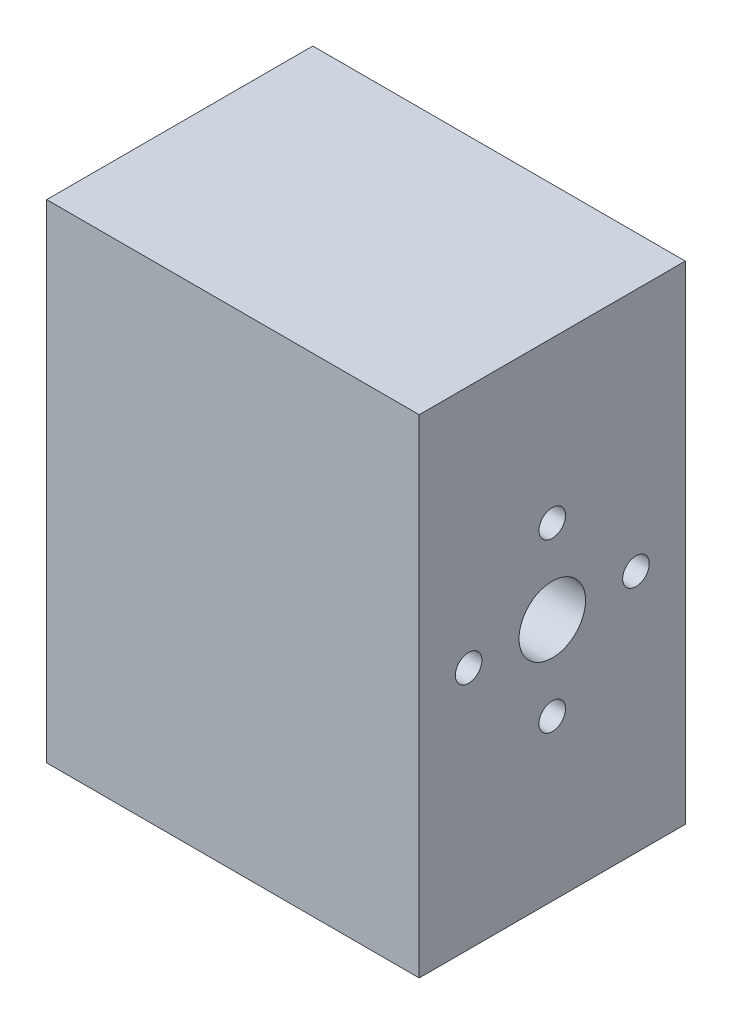
ISO-10303-21;
HEADER;
FILE_DESCRIPTION(('STEP AP214'),'2;1');
FILE_NAME('part.step','',(''),(''),'','','');
FILE_SCHEMA(('AUTOMOTIVE_DESIGN { 1 0 10303 214 1 1 1 1 }'));
ENDSEC;
DATA;
#1=APPLICATION_CONTEXT('core data for automotive mechanical design processes');
#2=APPLICATION_PROTOCOL_DEFINITION('international standard','automotive_design',2000,#1);
#3=PRODUCT_CONTEXT('',#1,'mechanical');
#4=PRODUCT('Part','Part','',(#3));
#5=PRODUCT_RELATED_PRODUCT_CATEGORY('part','',(#4));
#6=PRODUCT_DEFINITION_FORMATION('','',#4);
#7=PRODUCT_DEFINITION_CONTEXT('part definition',#1,'design');
#8=PRODUCT_DEFINITION('design','',#6,#7);
#9=PRODUCT_DEFINITION_SHAPE('','',#8);
#10=(LENGTH_UNIT() NAMED_UNIT(*) SI_UNIT(.MILLI.,.METRE.));
#11=(NAMED_UNIT(*) PLANE_ANGLE_UNIT() SI_UNIT($,.RADIAN.));
#12=(NAMED_UNIT(*) SI_UNIT($,.STERADIAN.) SOLID_ANGLE_UNIT());
#13=UNCERTAINTY_MEASURE_WITH_UNIT(LENGTH_MEASURE(1.E-05),#10,'distance_accuracy_value','');
#14=(GEOMETRIC_REPRESENTATION_CONTEXT(3) GLOBAL_UNCERTAINTY_ASSIGNED_CONTEXT((#13)) GLOBAL_UNIT_ASSIGNED_CONTEXT((#10,
#11,#12)) REPRESENTATION_CONTEXT('',''));
#15=CARTESIAN_POINT('',(0.,0.,0.));
#16=DIRECTION('',(0.,0.,1.));
#17=DIRECTION('',(1.,0.,0.));
#18=AXIS2_PLACEMENT_3D('',#15,#16,#17);
#19=CARTESIAN_POINT('',(0.,0.,30.));
#20=DIRECTION('',(1.,0.,0.));
#21=DIRECTION('',(0.,0.,-1.));
#22=AXIS2_PLACEMENT_3D('',#19,#20,#21);
#23=PLANE('',#22);
#24=CARTESIAN_POINT('',(0.,27.5,24.4344748391705));
#25=DIRECTION('',(1.,0.,0.));
#26=DIRECTION('',(0.,0.,-1.));
#27=AXIS2_PLACEMENT_3D('',#24,#25,#26);
#28=CIRCLE('',#27,1.5);
#29=CARTESIAN_POINT('',(0.,27.5,22.9344748391705));
#30=VERTEX_POINT('',#29);
#31=EDGE_CURVE('E131',#30,#30,#28,.T.);
#32=ORIENTED_EDGE('',*,*,#31,.T.);
#33=EDGE_LOOP('',(#32));
#34=FACE_BOUND('',#33,.T.);
#35=CARTESIAN_POINT('',(0.,18.0655251608295,14.9999999999999));
#36=DIRECTION('',(1.,0.,0.));
#37=DIRECTION('',(0.,0.,-1.));
#38=AXIS2_PLACEMENT_3D('',#35,#36,#37);
#39=CIRCLE('',#38,1.5);
#40=CARTESIAN_POINT('',(0.,18.0655251608295,13.4999999999999));
#41=VERTEX_POINT('',#40);
#42=EDGE_CURVE('E125',#41,#41,#39,.T.);
#43=ORIENTED_EDGE('',*,*,#42,.T.);
#44=EDGE_LOOP('',(#43));
#45=FACE_BOUND('',#44,.T.);
#46=CARTESIAN_POINT('',(0.,27.5000000000001,5.56552516082952));
#47=DIRECTION('',(1.,0.,0.));
#48=DIRECTION('',(0.,0.,-1.));
#49=AXIS2_PLACEMENT_3D('',#46,#47,#48);
#50=CIRCLE('',#49,1.5);
#51=CARTESIAN_POINT('',(0.,27.5000000000001,4.06552516082952));
#52=VERTEX_POINT('',#51);
#53=EDGE_CURVE('E119',#52,#52,#50,.T.);
#54=ORIENTED_EDGE('',*,*,#53,.T.);
#55=EDGE_LOOP('',(#54));
#56=FACE_BOUND('',#55,.T.);
#57=CARTESIAN_POINT('',(0.,36.9344748391705,15.));
#58=DIRECTION('',(1.,0.,0.));
#59=DIRECTION('',(0.,0.,-1.));
#60=AXIS2_PLACEMENT_3D('',#57,#58,#59);
#61=CIRCLE('',#60,1.5);
#62=CARTESIAN_POINT('',(0.,36.9344748391705,13.5));
#63=VERTEX_POINT('',#62);
#64=EDGE_CURVE('E113',#63,#63,#61,.T.);
#65=ORIENTED_EDGE('',*,*,#64,.T.);
#66=EDGE_LOOP('',(#65));
#67=FACE_BOUND('',#66,.T.);
#68=CARTESIAN_POINT('',(0.,27.5,15.));
#69=DIRECTION('',(1.,0.,0.));
#70=DIRECTION('',(0.,0.,-1.));
#71=AXIS2_PLACEMENT_3D('',#68,#69,#70);
#72=CIRCLE('',#71,3.75);
#73=CARTESIAN_POINT('',(0.,27.5,11.25));
#74=VERTEX_POINT('',#73);
#75=EDGE_CURVE('E99',#74,#74,#72,.T.);
#76=ORIENTED_EDGE('',*,*,#75,.T.);
#77=EDGE_LOOP('',(#76));
#78=FACE_BOUND('',#77,.T.);
#79=DIRECTION('',(0.,-1.,0.));
#80=VECTOR('',#79,1.);
#81=CARTESIAN_POINT('',(0.,0.,0.));
#82=LINE('',#81,#80);
#83=CARTESIAN_POINT('',(0.,55.,0.));
#84=VERTEX_POINT('',#83);
#85=CARTESIAN_POINT('',(0.,0.,0.));
#86=VERTEX_POINT('',#85);
#87=EDGE_CURVE('E96',#84,#86,#82,.T.);
#88=ORIENTED_EDGE('',*,*,#87,.T.);
#89=DIRECTION('',(0.,0.,-1.));
#90=VECTOR('',#89,1.);
#91=CARTESIAN_POINT('',(0.,0.,30.));
#92=LINE('',#91,#90);
#93=CARTESIAN_POINT('',(0.,0.,30.));
#94=VERTEX_POINT('',#93);
#95=EDGE_CURVE('E11',#94,#86,#92,.T.);
#96=ORIENTED_EDGE('',*,*,#95,.F.);
#97=DIRECTION('',(0.,-1.,0.));
#98=VECTOR('',#97,1.);
#99=CARTESIAN_POINT('',(0.,0.,30.));
#100=LINE('',#99,#98);
#101=CARTESIAN_POINT('',(0.,55.,30.));
#102=VERTEX_POINT('',#101);
#103=EDGE_CURVE('E84',#102,#94,#100,.T.);
#104=ORIENTED_EDGE('',*,*,#103,.F.);
#105=DIRECTION('',(0.,0.,-1.));
#106=VECTOR('',#105,1.);
#107=CARTESIAN_POINT('',(0.,55.,30.));
#108=LINE('',#107,#106);
#109=EDGE_CURVE('E92',#102,#84,#108,.T.);
#110=ORIENTED_EDGE('',*,*,#109,.T.);
#111=EDGE_LOOP('',(#88,#96,#104,#110));
#112=FACE_BOUND('',#111,.T.);
#113=ADVANCED_FACE('F33',(#34,#45,#56,#67,#78,#112),#23,.F.);
#114=CARTESIAN_POINT('',(0.,0.,30.));
#115=DIRECTION('',(0.,1.,0.));
#116=DIRECTION('',(0.,0.,1.));
#117=AXIS2_PLACEMENT_3D('',#114,#115,#116);
#118=PLANE('',#117);
#119=DIRECTION('',(1.,0.,0.));
#120=VECTOR('',#119,1.);
#121=CARTESIAN_POINT('',(0.,0.,0.));
#122=LINE('',#121,#120);
#123=CARTESIAN_POINT('',(42.,0.,0.));
#124=VERTEX_POINT('',#123);
#125=EDGE_CURVE('E88',#86,#124,#122,.T.);
#126=ORIENTED_EDGE('',*,*,#125,.T.);
#127=DIRECTION('',(0.,0.,-1.));
#128=VECTOR('',#127,1.);
#129=CARTESIAN_POINT('',(42.,0.,30.));
#130=LINE('',#129,#128);
#131=CARTESIAN_POINT('',(42.,0.,30.));
#132=VERTEX_POINT('',#131);
#133=EDGE_CURVE('E41',#132,#124,#130,.T.);
#134=ORIENTED_EDGE('',*,*,#133,.F.);
#135=DIRECTION('',(1.,0.,0.));
#136=VECTOR('',#135,1.);
#137=CARTESIAN_POINT('',(0.,0.,30.));
#138=LINE('',#137,#136);
#139=EDGE_CURVE('E79',#94,#132,#138,.T.);
#140=ORIENTED_EDGE('',*,*,#139,.F.);
#141=ORIENTED_EDGE('',*,*,#95,.T.);
#142=EDGE_LOOP('',(#126,#134,#140,#141));
#143=FACE_BOUND('',#142,.T.);
#144=ADVANCED_FACE('F87',(#143),#118,.F.);
#145=CARTESIAN_POINT('',(42.,0.,30.));
#146=DIRECTION('',(-1.,0.,0.));
#147=DIRECTION('',(0.,0.,1.));
#148=AXIS2_PLACEMENT_3D('',#145,#146,#147);
#149=PLANE('',#148);
#150=CARTESIAN_POINT('',(42.,27.5,24.4344748391705));
#151=DIRECTION('',(1.,0.,0.));
#152=DIRECTION('',(0.,0.,-1.));
#153=AXIS2_PLACEMENT_3D('',#150,#151,#152);
#154=CIRCLE('',#153,1.5);
#155=CARTESIAN_POINT('',(42.,27.5,22.9344748391705));
#156=VERTEX_POINT('',#155);
#157=EDGE_CURVE('E134',#156,#156,#154,.T.);
#158=ORIENTED_EDGE('',*,*,#157,.F.);
#159=EDGE_LOOP('',(#158));
#160=FACE_BOUND('',#159,.T.);
#161=CARTESIAN_POINT('',(42.,18.0655251608295,14.9999999999999));
#162=DIRECTION('',(1.,0.,0.));
#163=DIRECTION('',(0.,0.,-1.));
#164=AXIS2_PLACEMENT_3D('',#161,#162,#163);
#165=CIRCLE('',#164,1.5);
#166=CARTESIAN_POINT('',(42.,18.0655251608295,13.4999999999999));
#167=VERTEX_POINT('',#166);
#168=EDGE_CURVE('E128',#167,#167,#165,.T.);
#169=ORIENTED_EDGE('',*,*,#168,.F.);
#170=EDGE_LOOP('',(#169));
#171=FACE_BOUND('',#170,.T.);
#172=CARTESIAN_POINT('',(42.,27.5000000000001,5.56552516082952));
#173=DIRECTION('',(1.,0.,0.));
#174=DIRECTION('',(0.,0.,-1.));
#175=AXIS2_PLACEMENT_3D('',#172,#173,#174);
#176=CIRCLE('',#175,1.5);
#177=CARTESIAN_POINT('',(42.,27.5000000000001,4.06552516082952));
#178=VERTEX_POINT('',#177);
#179=EDGE_CURVE('E122',#178,#178,#176,.T.);
#180=ORIENTED_EDGE('',*,*,#179,.F.);
#181=EDGE_LOOP('',(#180));
#182=FACE_BOUND('',#181,.T.);
#183=CARTESIAN_POINT('',(42.,36.9344748391705,15.));
#184=DIRECTION('',(1.,0.,0.));
#185=DIRECTION('',(0.,0.,-1.));
#186=AXIS2_PLACEMENT_3D('',#183,#184,#185);
#187=CIRCLE('',#186,1.5);
#188=CARTESIAN_POINT('',(42.,36.9344748391705,13.5));
#189=VERTEX_POINT('',#188);
#190=EDGE_CURVE('E116',#189,#189,#187,.T.);
#191=ORIENTED_EDGE('',*,*,#190,.F.);
#192=EDGE_LOOP('',(#191));
#193=FACE_BOUND('',#192,.T.);
#194=CARTESIAN_POINT('',(42.,27.5,15.));
#195=DIRECTION('',(1.,0.,0.));
#196=DIRECTION('',(0.,0.,-1.));
#197=AXIS2_PLACEMENT_3D('',#194,#195,#196);
#198=CIRCLE('',#197,3.75);
#199=CARTESIAN_POINT('',(42.,27.5,11.25));
#200=VERTEX_POINT('',#199);
#201=EDGE_CURVE('E110',#200,#200,#198,.T.);
#202=ORIENTED_EDGE('',*,*,#201,.F.);
#203=EDGE_LOOP('',(#202));
#204=FACE_BOUND('',#203,.T.);
#205=DIRECTION('',(0.,1.,0.));
#206=VECTOR('',#205,1.);
#207=CARTESIAN_POINT('',(42.,0.,0.));
#208=LINE('',#207,#206);
#209=CARTESIAN_POINT('',(42.,55.,0.));
#210=VERTEX_POINT('',#209);
#211=EDGE_CURVE('E66',#124,#210,#208,.T.);
#212=ORIENTED_EDGE('',*,*,#211,.T.);
#213=DIRECTION('',(0.,0.,-1.));
#214=VECTOR('',#213,1.);
#215=CARTESIAN_POINT('',(42.,55.,30.));
#216=LINE('',#215,#214);
#217=CARTESIAN_POINT('',(42.,55.,30.));
#218=VERTEX_POINT('',#217);
#219=EDGE_CURVE('E89',#218,#210,#216,.T.);
#220=ORIENTED_EDGE('',*,*,#219,.F.);
#221=DIRECTION('',(0.,1.,0.));
#222=VECTOR('',#221,1.);
#223=CARTESIAN_POINT('',(42.,0.,30.));
#224=LINE('',#223,#222);
#225=EDGE_CURVE('E82',#132,#218,#224,.T.);
#226=ORIENTED_EDGE('',*,*,#225,.F.);
#227=ORIENTED_EDGE('',*,*,#133,.T.);
#228=EDGE_LOOP('',(#212,#220,#226,#227));
#229=FACE_BOUND('',#228,.T.);
#230=ADVANCED_FACE('F90',(#160,#171,#182,#193,#204,#229),#149,.F.);
#231=CARTESIAN_POINT('',(0.,55.,30.));
#232=DIRECTION('',(0.,-1.,0.));
#233=DIRECTION('',(0.,0.,-1.));
#234=AXIS2_PLACEMENT_3D('',#231,#232,#233);
#235=PLANE('',#234);
#236=DIRECTION('',(-1.,0.,0.));
#237=VECTOR('',#236,1.);
#238=CARTESIAN_POINT('',(0.,55.,0.));
#239=LINE('',#238,#237);
#240=EDGE_CURVE('E72',#210,#84,#239,.T.);
#241=ORIENTED_EDGE('',*,*,#240,.T.);
#242=ORIENTED_EDGE('',*,*,#109,.F.);
#243=DIRECTION('',(-1.,0.,0.));
#244=VECTOR('',#243,1.);
#245=CARTESIAN_POINT('',(0.,55.,30.));
#246=LINE('',#245,#244);
#247=EDGE_CURVE('E49',#218,#102,#246,.T.);
#248=ORIENTED_EDGE('',*,*,#247,.F.);
#249=ORIENTED_EDGE('',*,*,#219,.T.);
#250=EDGE_LOOP('',(#241,#242,#248,#249));
#251=FACE_BOUND('',#250,.T.);
#252=ADVANCED_FACE('F104',(#251),#235,.F.);
#253=CARTESIAN_POINT('',(0.,0.,30.));
#254=DIRECTION('',(0.,0.,-1.));
#255=DIRECTION('',(-1.,0.,0.));
#256=AXIS2_PLACEMENT_3D('',#253,#254,#255);
#257=PLANE('',#256);
#258=ORIENTED_EDGE('',*,*,#103,.T.);
#259=ORIENTED_EDGE('',*,*,#139,.T.);
#260=ORIENTED_EDGE('',*,*,#225,.T.);
#261=ORIENTED_EDGE('',*,*,#247,.T.);
#262=EDGE_LOOP('',(#258,#259,#260,#261));
#263=FACE_BOUND('',#262,.T.);
#264=ADVANCED_FACE('F80',(#263),#257,.F.);
#265=CARTESIAN_POINT('',(0.,0.,0.));
#266=DIRECTION('',(0.,0.,-1.));
#267=DIRECTION('',(-1.,0.,0.));
#268=AXIS2_PLACEMENT_3D('',#265,#266,#267);
#269=PLANE('',#268);
#270=ORIENTED_EDGE('',*,*,#87,.F.);
#271=ORIENTED_EDGE('',*,*,#240,.F.);
#272=ORIENTED_EDGE('',*,*,#211,.F.);
#273=ORIENTED_EDGE('',*,*,#125,.F.);
#274=EDGE_LOOP('',(#270,#271,#272,#273));
#275=FACE_BOUND('',#274,.T.);
#276=ADVANCED_FACE('F107',(#275),#269,.T.);
#277=CARTESIAN_POINT('',(0.,27.5,15.));
#278=DIRECTION('',(1.,0.,0.));
#279=DIRECTION('',(0.,0.,-1.));
#280=AXIS2_PLACEMENT_3D('',#277,#278,#279);
#281=CYLINDRICAL_SURFACE('',#280,3.75);
#282=CARTESIAN_POINT('',(0.,27.5,11.25));
#283=CARTESIAN_POINT('',(0.437499999999999,27.5,11.25));
#284=CARTESIAN_POINT('',(0.875,27.5,11.25));
#285=CARTESIAN_POINT('',(1.75,27.5,11.25));
#286=CARTESIAN_POINT('',(2.1875,27.5,11.25));
#287=CARTESIAN_POINT('',(3.0625,27.5,11.25));
#288=CARTESIAN_POINT('',(3.5,27.5,11.25));
#289=CARTESIAN_POINT('',(4.375,27.5,11.25));
#290=CARTESIAN_POINT('',(4.8125,27.5,11.25));
#291=CARTESIAN_POINT('',(5.6875,27.5,11.25));
#292=CARTESIAN_POINT('',(6.125,27.5,11.25));
#293=CARTESIAN_POINT('',(7.,27.5,11.25));
#294=CARTESIAN_POINT('',(7.4375,27.5,11.25));
#295=CARTESIAN_POINT('',(8.3125,27.5,11.25));
#296=CARTESIAN_POINT('',(8.75,27.5,11.25));
#297=CARTESIAN_POINT('',(9.625,27.5,11.25));
#298=CARTESIAN_POINT('',(10.0625,27.5,11.25));
#299=CARTESIAN_POINT('',(10.9375,27.5,11.25));
#300=CARTESIAN_POINT('',(11.375,27.5,11.25));
#301=CARTESIAN_POINT('',(12.25,27.5,11.25));
#302=CARTESIAN_POINT('',(12.6875,27.5,11.25));
#303=CARTESIAN_POINT('',(13.5625,27.5,11.25));
#304=CARTESIAN_POINT('',(14.,27.5,11.25));
#305=CARTESIAN_POINT('',(14.875,27.5,11.25));
#306=CARTESIAN_POINT('',(15.3125,27.5,11.25));
#307=CARTESIAN_POINT('',(16.1875,27.5,11.25));
#308=CARTESIAN_POINT('',(16.625,27.5,11.25));
#309=CARTESIAN_POINT('',(17.5,27.5,11.25));
#310=CARTESIAN_POINT('',(17.9375,27.5,11.25));
#311=CARTESIAN_POINT('',(18.8125,27.5,11.25));
#312=CARTESIAN_POINT('',(19.25,27.5,11.25));
#313=CARTESIAN_POINT('',(20.125,27.5,11.25));
#314=CARTESIAN_POINT('',(20.5625,27.5,11.25));
#315=CARTESIAN_POINT('',(21.4375,27.5,11.25));
#316=CARTESIAN_POINT('',(21.875,27.5,11.25));
#317=CARTESIAN_POINT('',(22.75,27.5,11.25));
#318=CARTESIAN_POINT('',(23.1875,27.5,11.25));
#319=CARTESIAN_POINT('',(24.0625,27.5,11.25));
#320=CARTESIAN_POINT('',(24.5,27.5,11.25));
#321=CARTESIAN_POINT('',(25.375,27.5,11.25));
#322=CARTESIAN_POINT('',(25.8125,27.5,11.25));
#323=CARTESIAN_POINT('',(26.6875,27.5,11.25));
#324=CARTESIAN_POINT('',(27.125,27.5,11.25));
#325=CARTESIAN_POINT('',(28.,27.5,11.25));
#326=CARTESIAN_POINT('',(28.4375,27.5,11.25));
#327=CARTESIAN_POINT('',(29.3125,27.5,11.25));
#328=CARTESIAN_POINT('',(29.75,27.5,11.25));
#329=CARTESIAN_POINT('',(30.625,27.5,11.25));
#330=CARTESIAN_POINT('',(31.0625,27.5,11.25));
#331=CARTESIAN_POINT('',(31.9375,27.5,11.25));
#332=CARTESIAN_POINT('',(32.375,27.5,11.25));
#333=CARTESIAN_POINT('',(33.25,27.5,11.25));
#334=CARTESIAN_POINT('',(33.6875,27.5,11.25));
#335=CARTESIAN_POINT('',(34.5625,27.5,11.25));
#336=CARTESIAN_POINT('',(35.,27.5,11.25));
#337=CARTESIAN_POINT('',(35.875,27.5,11.25));
#338=CARTESIAN_POINT('',(36.3125,27.5,11.25));
#339=CARTESIAN_POINT('',(37.1875,27.5,11.25));
#340=CARTESIAN_POINT('',(37.625,27.5,11.25));
#341=CARTESIAN_POINT('',(38.5,27.5,11.25));
#342=CARTESIAN_POINT('',(38.9375,27.5,11.25));
#343=CARTESIAN_POINT('',(39.8125,27.5,11.25));
#344=CARTESIAN_POINT('',(40.25,27.5,11.25));
#345=CARTESIAN_POINT('',(41.125,27.5,11.25));
#346=CARTESIAN_POINT('',(41.5625,27.5,11.25));
#347=CARTESIAN_POINT('',(42.,27.5,11.25));
#348=B_SPLINE_CURVE_WITH_KNOTS('',3,(#282,#283,#284,#285,#286,#287,#288,#289,#290,#291,#292,
#293,#294,#295,#296,#297,#298,#299,#300,#301,#302,#303,#304,#305,#306,#307,#308,#309,#310,#311,
#312,#313,#314,#315,#316,#317,#318,#319,#320,#321,#322,#323,#324,#325,#326,#327,#328,#329,#330,
#331,#332,#333,#334,#335,#336,#337,#338,#339,#340,#341,#342,#343,#344,#345,#346,#347),
.UNSPECIFIED.,.F.,.F.,(4,2,2,2,2,2,2,2,2,2,2,2,2,2,2,2,2,2,2,2,2,2,2,2,2,2,2,2,2,2,2,2,4),(0.,
1.3125,2.625,3.9375,5.25,6.5625,7.875,9.1875,10.5,11.8125,13.125,14.4375,15.75,17.0625,18.375,
19.6875,21.,22.3125,23.625,24.9375,26.25,27.5625,28.875,30.1875,31.5,32.8125,34.125,35.4375,
36.75,38.0625,39.375,40.6875,42.),.UNSPECIFIED.);
#349=EDGE_CURVE('BSEAM160',#74,#200,#348,.T.);
#350=ORIENTED_EDGE('',*,*,#75,.F.);
#351=ORIENTED_EDGE('',*,*,#201,.T.);
#352=ORIENTED_EDGE('',*,*,#349,.T.);
#353=ORIENTED_EDGE('',*,*,#349,.F.);
#354=EDGE_LOOP('',(#350,#352,#351,#353));
#355=FACE_BOUND('',#354,.T.);
#356=ADVANCED_FACE('F160',(#355),#281,.F.);
#357=CARTESIAN_POINT('',(0.,36.9344748391705,15.));
#358=DIRECTION('',(1.,0.,0.));
#359=DIRECTION('',(0.,0.,-1.));
#360=AXIS2_PLACEMENT_3D('',#357,#358,#359);
#361=CYLINDRICAL_SURFACE('',#360,1.5);
#362=CARTESIAN_POINT('',(0.,36.9344748391705,13.5));
#363=CARTESIAN_POINT('',(0.437499999999999,36.9344748391705,13.5));
#364=CARTESIAN_POINT('',(0.875,36.9344748391705,13.5));
#365=CARTESIAN_POINT('',(1.75,36.9344748391705,13.5));
#366=CARTESIAN_POINT('',(2.1875,36.9344748391705,13.5));
#367=CARTESIAN_POINT('',(3.0625,36.9344748391705,13.5));
#368=CARTESIAN_POINT('',(3.5,36.9344748391705,13.5));
#369=CARTESIAN_POINT('',(4.375,36.9344748391705,13.5));
#370=CARTESIAN_POINT('',(4.8125,36.9344748391705,13.5));
#371=CARTESIAN_POINT('',(5.6875,36.9344748391705,13.5));
#372=CARTESIAN_POINT('',(6.125,36.9344748391705,13.5));
#373=CARTESIAN_POINT('',(7.,36.9344748391705,13.5));
#374=CARTESIAN_POINT('',(7.4375,36.9344748391705,13.5));
#375=CARTESIAN_POINT('',(8.3125,36.9344748391705,13.5));
#376=CARTESIAN_POINT('',(8.75,36.9344748391705,13.5));
#377=CARTESIAN_POINT('',(9.625,36.9344748391705,13.5));
#378=CARTESIAN_POINT('',(10.0625,36.9344748391705,13.5));
#379=CARTESIAN_POINT('',(10.9375,36.9344748391705,13.5));
#380=CARTESIAN_POINT('',(11.375,36.9344748391705,13.5));
#381=CARTESIAN_POINT('',(12.25,36.9344748391705,13.5));
#382=CARTESIAN_POINT('',(12.6875,36.9344748391705,13.5));
#383=CARTESIAN_POINT('',(13.5625,36.9344748391705,13.5));
#384=CARTESIAN_POINT('',(14.,36.9344748391705,13.5));
#385=CARTESIAN_POINT('',(14.875,36.9344748391705,13.5));
#386=CARTESIAN_POINT('',(15.3125,36.9344748391705,13.5));
#387=CARTESIAN_POINT('',(16.1875,36.9344748391705,13.5));
#388=CARTESIAN_POINT('',(16.625,36.9344748391705,13.5));
#389=CARTESIAN_POINT('',(17.5,36.9344748391705,13.5));
#390=CARTESIAN_POINT('',(17.9375,36.9344748391705,13.5));
#391=CARTESIAN_POINT('',(18.8125,36.9344748391705,13.5));
#392=CARTESIAN_POINT('',(19.25,36.9344748391705,13.5));
#393=CARTESIAN_POINT('',(20.125,36.9344748391705,13.5));
#394=CARTESIAN_POINT('',(20.5625,36.9344748391705,13.5));
#395=CARTESIAN_POINT('',(21.4375,36.9344748391705,13.5));
#396=CARTESIAN_POINT('',(21.875,36.9344748391705,13.5));
#397=CARTESIAN_POINT('',(22.75,36.9344748391705,13.5));
#398=CARTESIAN_POINT('',(23.1875,36.9344748391705,13.5));
#399=CARTESIAN_POINT('',(24.0625,36.9344748391705,13.5));
#400=CARTESIAN_POINT('',(24.5,36.9344748391705,13.5));
#401=CARTESIAN_POINT('',(25.375,36.9344748391705,13.5));
#402=CARTESIAN_POINT('',(25.8125,36.9344748391705,13.5));
#403=CARTESIAN_POINT('',(26.6875,36.9344748391705,13.5));
#404=CARTESIAN_POINT('',(27.125,36.9344748391705,13.5));
#405=CARTESIAN_POINT('',(28.,36.9344748391705,13.5));
#406=CARTESIAN_POINT('',(28.4375,36.9344748391705,13.5));
#407=CARTESIAN_POINT('',(29.3125,36.9344748391705,13.5));
#408=CARTESIAN_POINT('',(29.75,36.9344748391705,13.5));
#409=CARTESIAN_POINT('',(30.625,36.9344748391705,13.5));
#410=CARTESIAN_POINT('',(31.0625,36.9344748391705,13.5));
#411=CARTESIAN_POINT('',(31.9375,36.9344748391705,13.5));
#412=CARTESIAN_POINT('',(32.375,36.9344748391705,13.5));
#413=CARTESIAN_POINT('',(33.25,36.9344748391705,13.5));
#414=CARTESIAN_POINT('',(33.6875,36.9344748391705,13.5));
#415=CARTESIAN_POINT('',(34.5625,36.9344748391705,13.5));
#416=CARTESIAN_POINT('',(35.,36.9344748391705,13.5));
#417=CARTESIAN_POINT('',(35.875,36.9344748391705,13.5));
#418=CARTESIAN_POINT('',(36.3125,36.9344748391705,13.5));
#419=CARTESIAN_POINT('',(37.1875,36.9344748391705,13.5));
#420=CARTESIAN_POINT('',(37.625,36.9344748391705,13.5));
#421=CARTESIAN_POINT('',(38.5,36.9344748391705,13.5));
#422=CARTESIAN_POINT('',(38.9375,36.9344748391705,13.5));
#423=CARTESIAN_POINT('',(39.8125,36.9344748391705,13.5));
#424=CARTESIAN_POINT('',(40.25,36.9344748391705,13.5));
#425=CARTESIAN_POINT('',(41.125,36.9344748391705,13.5));
#426=CARTESIAN_POINT('',(41.5625,36.9344748391705,13.5));
#427=CARTESIAN_POINT('',(42.,36.9344748391705,13.5));
#428=B_SPLINE_CURVE_WITH_KNOTS('',3,(#362,#363,#364,#365,#366,#367,#368,#369,#370,#371,#372,
#373,#374,#375,#376,#377,#378,#379,#380,#381,#382,#383,#384,#385,#386,#387,#388,#389,#390,#391,
#392,#393,#394,#395,#396,#397,#398,#399,#400,#401,#402,#403,#404,#405,#406,#407,#408,#409,#410,
#411,#412,#413,#414,#415,#416,#417,#418,#419,#420,#421,#422,#423,#424,#425,#426,#427),
.UNSPECIFIED.,.F.,.F.,(4,2,2,2,2,2,2,2,2,2,2,2,2,2,2,2,2,2,2,2,2,2,2,2,2,2,2,2,2,2,2,2,4),(0.,
1.3125,2.625,3.9375,5.25,6.5625,7.875,9.1875,10.5,11.8125,13.125,14.4375,15.75,17.0625,18.375,
19.6875,21.,22.3125,23.625,24.9375,26.25,27.5625,28.875,30.1875,31.5,32.8125,34.125,35.4375,
36.75,38.0625,39.375,40.6875,42.),.UNSPECIFIED.);
#429=EDGE_CURVE('BSEAM162',#63,#189,#428,.T.);
#430=ORIENTED_EDGE('',*,*,#64,.F.);
#431=ORIENTED_EDGE('',*,*,#190,.T.);
#432=ORIENTED_EDGE('',*,*,#429,.T.);
#433=ORIENTED_EDGE('',*,*,#429,.F.);
#434=EDGE_LOOP('',(#430,#432,#431,#433));
#435=FACE_BOUND('',#434,.T.);
#436=ADVANCED_FACE('F162',(#435),#361,.F.);
#437=CARTESIAN_POINT('',(0.,27.5000000000001,5.56552516082952));
#438=DIRECTION('',(1.,0.,0.));
#439=DIRECTION('',(0.,0.,-1.));
#440=AXIS2_PLACEMENT_3D('',#437,#438,#439);
#441=CYLINDRICAL_SURFACE('',#440,1.5);
#442=CARTESIAN_POINT('',(0.,27.5000000000001,4.06552516082952));
#443=CARTESIAN_POINT('',(0.437499999999999,27.5000000000001,4.06552516082952));
#444=CARTESIAN_POINT('',(0.875,27.5000000000001,4.06552516082952));
#445=CARTESIAN_POINT('',(1.75,27.5000000000001,4.06552516082952));
#446=CARTESIAN_POINT('',(2.1875,27.5000000000001,4.06552516082952));
#447=CARTESIAN_POINT('',(3.0625,27.5000000000001,4.06552516082952));
#448=CARTESIAN_POINT('',(3.5,27.5000000000001,4.06552516082952));
#449=CARTESIAN_POINT('',(4.375,27.5000000000001,4.06552516082952));
#450=CARTESIAN_POINT('',(4.8125,27.5000000000001,4.06552516082952));
#451=CARTESIAN_POINT('',(5.6875,27.5000000000001,4.06552516082952));
#452=CARTESIAN_POINT('',(6.125,27.5000000000001,4.06552516082952));
#453=CARTESIAN_POINT('',(7.,27.5000000000001,4.06552516082952));
#454=CARTESIAN_POINT('',(7.4375,27.5000000000001,4.06552516082952));
#455=CARTESIAN_POINT('',(8.3125,27.5000000000001,4.06552516082952));
#456=CARTESIAN_POINT('',(8.75,27.5000000000001,4.06552516082952));
#457=CARTESIAN_POINT('',(9.625,27.5000000000001,4.06552516082952));
#458=CARTESIAN_POINT('',(10.0625,27.5000000000001,4.06552516082952));
#459=CARTESIAN_POINT('',(10.9375,27.5000000000001,4.06552516082952));
#460=CARTESIAN_POINT('',(11.375,27.5000000000001,4.06552516082952));
#461=CARTESIAN_POINT('',(12.25,27.5000000000001,4.06552516082952));
#462=CARTESIAN_POINT('',(12.6875,27.5000000000001,4.06552516082952));
#463=CARTESIAN_POINT('',(13.5625,27.5000000000001,4.06552516082952));
#464=CARTESIAN_POINT('',(14.,27.5000000000001,4.06552516082952));
#465=CARTESIAN_POINT('',(14.875,27.5000000000001,4.06552516082952));
#466=CARTESIAN_POINT('',(15.3125,27.5000000000001,4.06552516082952));
#467=CARTESIAN_POINT('',(16.1875,27.5000000000001,4.06552516082952));
#468=CARTESIAN_POINT('',(16.625,27.5000000000001,4.06552516082952));
#469=CARTESIAN_POINT('',(17.5,27.5000000000001,4.06552516082952));
#470=CARTESIAN_POINT('',(17.9375,27.5000000000001,4.06552516082952));
#471=CARTESIAN_POINT('',(18.8125,27.5000000000001,4.06552516082952));
#472=CARTESIAN_POINT('',(19.25,27.5000000000001,4.06552516082952));
#473=CARTESIAN_POINT('',(20.125,27.5000000000001,4.06552516082952));
#474=CARTESIAN_POINT('',(20.5625,27.5000000000001,4.06552516082952));
#475=CARTESIAN_POINT('',(21.4375,27.5000000000001,4.06552516082952));
#476=CARTESIAN_POINT('',(21.875,27.5000000000001,4.06552516082952));
#477=CARTESIAN_POINT('',(22.75,27.5000000000001,4.06552516082952));
#478=CARTESIAN_POINT('',(23.1875,27.5000000000001,4.06552516082952));
#479=CARTESIAN_POINT('',(24.0625,27.5000000000001,4.06552516082952));
#480=CARTESIAN_POINT('',(24.5,27.5000000000001,4.06552516082952));
#481=CARTESIAN_POINT('',(25.375,27.5000000000001,4.06552516082952));
#482=CARTESIAN_POINT('',(25.8125,27.5000000000001,4.06552516082952));
#483=CARTESIAN_POINT('',(26.6875,27.5000000000001,4.06552516082952));
#484=CARTESIAN_POINT('',(27.125,27.5000000000001,4.06552516082952));
#485=CARTESIAN_POINT('',(28.,27.5000000000001,4.06552516082952));
#486=CARTESIAN_POINT('',(28.4375,27.5000000000001,4.06552516082952));
#487=CARTESIAN_POINT('',(29.3125,27.5000000000001,4.06552516082952));
#488=CARTESIAN_POINT('',(29.75,27.5000000000001,4.06552516082952));
#489=CARTESIAN_POINT('',(30.625,27.5000000000001,4.06552516082952));
#490=CARTESIAN_POINT('',(31.0625,27.5000000000001,4.06552516082952));
#491=CARTESIAN_POINT('',(31.9375,27.5000000000001,4.06552516082952));
#492=CARTESIAN_POINT('',(32.375,27.5000000000001,4.06552516082952));
#493=CARTESIAN_POINT('',(33.25,27.5000000000001,4.06552516082952));
#494=CARTESIAN_POINT('',(33.6875,27.5000000000001,4.06552516082952));
#495=CARTESIAN_POINT('',(34.5625,27.5000000000001,4.06552516082952));
#496=CARTESIAN_POINT('',(35.,27.5000000000001,4.06552516082952));
#497=CARTESIAN_POINT('',(35.875,27.5000000000001,4.06552516082952));
#498=CARTESIAN_POINT('',(36.3125,27.5000000000001,4.06552516082952));
#499=CARTESIAN_POINT('',(37.1875,27.5000000000001,4.06552516082952));
#500=CARTESIAN_POINT('',(37.625,27.5000000000001,4.06552516082952));
#501=CARTESIAN_POINT('',(38.5,27.5000000000001,4.06552516082952));
#502=CARTESIAN_POINT('',(38.9375,27.5000000000001,4.06552516082952));
#503=CARTESIAN_POINT('',(39.8125,27.5000000000001,4.06552516082952));
#504=CARTESIAN_POINT('',(40.25,27.5000000000001,4.06552516082952));
#505=CARTESIAN_POINT('',(41.125,27.5000000000001,4.06552516082952));
#506=CARTESIAN_POINT('',(41.5625,27.5000000000001,4.06552516082952));
#507=CARTESIAN_POINT('',(42.,27.5000000000001,4.06552516082952));
#508=B_SPLINE_CURVE_WITH_KNOTS('',3,(#442,#443,#444,#445,#446,#447,#448,#449,#450,#451,#452,
#453,#454,#455,#456,#457,#458,#459,#460,#461,#462,#463,#464,#465,#466,#467,#468,#469,#470,#471,
#472,#473,#474,#475,#476,#477,#478,#479,#480,#481,#482,#483,#484,#485,#486,#487,#488,#489,#490,
#491,#492,#493,#494,#495,#496,#497,#498,#499,#500,#501,#502,#503,#504,#505,#506,#507),
.UNSPECIFIED.,.F.,.F.,(4,2,2,2,2,2,2,2,2,2,2,2,2,2,2,2,2,2,2,2,2,2,2,2,2,2,2,2,2,2,2,2,4),(0.,
1.3125,2.625,3.9375,5.25,6.5625,7.875,9.1875,10.5,11.8125,13.125,14.4375,15.75,17.0625,18.375,
19.6875,21.,22.3125,23.625,24.9375,26.25,27.5625,28.875,30.1875,31.5,32.8125,34.125,35.4375,
36.75,38.0625,39.375,40.6875,42.),.UNSPECIFIED.);
#509=EDGE_CURVE('BSEAM169',#52,#178,#508,.T.);
#510=ORIENTED_EDGE('',*,*,#53,.F.);
#511=ORIENTED_EDGE('',*,*,#179,.T.);
#512=ORIENTED_EDGE('',*,*,#509,.T.);
#513=ORIENTED_EDGE('',*,*,#509,.F.);
#514=EDGE_LOOP('',(#510,#512,#511,#513));
#515=FACE_BOUND('',#514,.T.);
#516=ADVANCED_FACE('F169',(#515),#441,.F.);
#517=CARTESIAN_POINT('',(0.,18.0655251608295,14.9999999999999));
#518=DIRECTION('',(1.,0.,0.));
#519=DIRECTION('',(0.,0.,-1.));
#520=AXIS2_PLACEMENT_3D('',#517,#518,#519);
#521=CYLINDRICAL_SURFACE('',#520,1.5);
#522=CARTESIAN_POINT('',(0.,18.0655251608295,13.4999999999999));
#523=CARTESIAN_POINT('',(0.437499999999999,18.0655251608295,13.4999999999999));
#524=CARTESIAN_POINT('',(0.875,18.0655251608295,13.4999999999999));
#525=CARTESIAN_POINT('',(1.75,18.0655251608295,13.4999999999999));
#526=CARTESIAN_POINT('',(2.1875,18.0655251608295,13.4999999999999));
#527=CARTESIAN_POINT('',(3.0625,18.0655251608295,13.4999999999999));
#528=CARTESIAN_POINT('',(3.5,18.0655251608295,13.4999999999999));
#529=CARTESIAN_POINT('',(4.375,18.0655251608295,13.4999999999999));
#530=CARTESIAN_POINT('',(4.8125,18.0655251608295,13.4999999999999));
#531=CARTESIAN_POINT('',(5.6875,18.0655251608295,13.4999999999999));
#532=CARTESIAN_POINT('',(6.125,18.0655251608295,13.4999999999999));
#533=CARTESIAN_POINT('',(7.,18.0655251608295,13.4999999999999));
#534=CARTESIAN_POINT('',(7.4375,18.0655251608295,13.4999999999999));
#535=CARTESIAN_POINT('',(8.3125,18.0655251608295,13.4999999999999));
#536=CARTESIAN_POINT('',(8.75,18.0655251608295,13.4999999999999));
#537=CARTESIAN_POINT('',(9.625,18.0655251608295,13.4999999999999));
#538=CARTESIAN_POINT('',(10.0625,18.0655251608295,13.4999999999999));
#539=CARTESIAN_POINT('',(10.9375,18.0655251608295,13.4999999999999));
#540=CARTESIAN_POINT('',(11.375,18.0655251608295,13.4999999999999));
#541=CARTESIAN_POINT('',(12.25,18.0655251608295,13.4999999999999));
#542=CARTESIAN_POINT('',(12.6875,18.0655251608295,13.4999999999999));
#543=CARTESIAN_POINT('',(13.5625,18.0655251608295,13.4999999999999));
#544=CARTESIAN_POINT('',(14.,18.0655251608295,13.4999999999999));
#545=CARTESIAN_POINT('',(14.875,18.0655251608295,13.4999999999999));
#546=CARTESIAN_POINT('',(15.3125,18.0655251608295,13.4999999999999));
#547=CARTESIAN_POINT('',(16.1875,18.0655251608295,13.4999999999999));
#548=CARTESIAN_POINT('',(16.625,18.0655251608295,13.4999999999999));
#549=CARTESIAN_POINT('',(17.5,18.0655251608295,13.4999999999999));
#550=CARTESIAN_POINT('',(17.9375,18.0655251608295,13.4999999999999));
#551=CARTESIAN_POINT('',(18.8125,18.0655251608295,13.4999999999999));
#552=CARTESIAN_POINT('',(19.25,18.0655251608295,13.4999999999999));
#553=CARTESIAN_POINT('',(20.125,18.0655251608295,13.4999999999999));
#554=CARTESIAN_POINT('',(20.5625,18.0655251608295,13.4999999999999));
#555=CARTESIAN_POINT('',(21.4375,18.0655251608295,13.4999999999999));
#556=CARTESIAN_POINT('',(21.875,18.0655251608295,13.4999999999999));
#557=CARTESIAN_POINT('',(22.75,18.0655251608295,13.4999999999999));
#558=CARTESIAN_POINT('',(23.1875,18.0655251608295,13.4999999999999));
#559=CARTESIAN_POINT('',(24.0625,18.0655251608295,13.4999999999999));
#560=CARTESIAN_POINT('',(24.5,18.0655251608295,13.4999999999999));
#561=CARTESIAN_POINT('',(25.375,18.0655251608295,13.4999999999999));
#562=CARTESIAN_POINT('',(25.8125,18.0655251608295,13.4999999999999));
#563=CARTESIAN_POINT('',(26.6875,18.0655251608295,13.4999999999999));
#564=CARTESIAN_POINT('',(27.125,18.0655251608295,13.4999999999999));
#565=CARTESIAN_POINT('',(28.,18.0655251608295,13.4999999999999));
#566=CARTESIAN_POINT('',(28.4375,18.0655251608295,13.4999999999999));
#567=CARTESIAN_POINT('',(29.3125,18.0655251608295,13.4999999999999));
#568=CARTESIAN_POINT('',(29.75,18.0655251608295,13.4999999999999));
#569=CARTESIAN_POINT('',(30.625,18.0655251608295,13.4999999999999));
#570=CARTESIAN_POINT('',(31.0625,18.0655251608295,13.4999999999999));
#571=CARTESIAN_POINT('',(31.9375,18.0655251608295,13.4999999999999));
#572=CARTESIAN_POINT('',(32.375,18.0655251608295,13.4999999999999));
#573=CARTESIAN_POINT('',(33.25,18.0655251608295,13.4999999999999));
#574=CARTESIAN_POINT('',(33.6875,18.0655251608295,13.4999999999999));
#575=CARTESIAN_POINT('',(34.5625,18.0655251608295,13.4999999999999));
#576=CARTESIAN_POINT('',(35.,18.0655251608295,13.4999999999999));
#577=CARTESIAN_POINT('',(35.875,18.0655251608295,13.4999999999999));
#578=CARTESIAN_POINT('',(36.3125,18.0655251608295,13.4999999999999));
#579=CARTESIAN_POINT('',(37.1875,18.0655251608295,13.4999999999999));
#580=CARTESIAN_POINT('',(37.625,18.0655251608295,13.4999999999999));
#581=CARTESIAN_POINT('',(38.5,18.0655251608295,13.4999999999999));
#582=CARTESIAN_POINT('',(38.9375,18.0655251608295,13.4999999999999));
#583=CARTESIAN_POINT('',(39.8125,18.0655251608295,13.4999999999999));
#584=CARTESIAN_POINT('',(40.25,18.0655251608295,13.4999999999999));
#585=CARTESIAN_POINT('',(41.125,18.0655251608295,13.4999999999999));
#586=CARTESIAN_POINT('',(41.5625,18.0655251608295,13.4999999999999));
#587=CARTESIAN_POINT('',(42.,18.0655251608295,13.4999999999999));
#588=B_SPLINE_CURVE_WITH_KNOTS('',3,(#522,#523,#524,#525,#526,#527,#528,#529,#530,#531,#532,
#533,#534,#535,#536,#537,#538,#539,#540,#541,#542,#543,#544,#545,#546,#547,#548,#549,#550,#551,
#552,#553,#554,#555,#556,#557,#558,#559,#560,#561,#562,#563,#564,#565,#566,#567,#568,#569,#570,
#571,#572,#573,#574,#575,#576,#577,#578,#579,#580,#581,#582,#583,#584,#585,#586,#587),
.UNSPECIFIED.,.F.,.F.,(4,2,2,2,2,2,2,2,2,2,2,2,2,2,2,2,2,2,2,2,2,2,2,2,2,2,2,2,2,2,2,2,4),(0.,
1.3125,2.625,3.9375,5.25,6.5625,7.875,9.1875,10.5,11.8125,13.125,14.4375,15.75,17.0625,18.375,
19.6875,21.,22.3125,23.625,24.9375,26.25,27.5625,28.875,30.1875,31.5,32.8125,34.125,35.4375,
36.75,38.0625,39.375,40.6875,42.),.UNSPECIFIED.);
#589=EDGE_CURVE('BSEAM145',#41,#167,#588,.T.);
#590=ORIENTED_EDGE('',*,*,#42,.F.);
#591=ORIENTED_EDGE('',*,*,#168,.T.);
#592=ORIENTED_EDGE('',*,*,#589,.T.);
#593=ORIENTED_EDGE('',*,*,#589,.F.);
#594=EDGE_LOOP('',(#590,#592,#591,#593));
#595=FACE_BOUND('',#594,.T.);
#596=ADVANCED_FACE('F145',(#595),#521,.F.);
#597=CARTESIAN_POINT('',(0.,27.5,24.4344748391705));
#598=DIRECTION('',(1.,0.,0.));
#599=DIRECTION('',(0.,0.,-1.));
#600=AXIS2_PLACEMENT_3D('',#597,#598,#599);
#601=CYLINDRICAL_SURFACE('',#600,1.5);
#602=CARTESIAN_POINT('',(0.,27.5,22.9344748391705));
#603=CARTESIAN_POINT('',(0.437499999999999,27.5,22.9344748391705));
#604=CARTESIAN_POINT('',(0.875,27.5,22.9344748391705));
#605=CARTESIAN_POINT('',(1.75,27.5,22.9344748391705));
#606=CARTESIAN_POINT('',(2.1875,27.5,22.9344748391705));
#607=CARTESIAN_POINT('',(3.0625,27.5,22.9344748391705));
#608=CARTESIAN_POINT('',(3.5,27.5,22.9344748391705));
#609=CARTESIAN_POINT('',(4.375,27.5,22.9344748391705));
#610=CARTESIAN_POINT('',(4.8125,27.5,22.9344748391705));
#611=CARTESIAN_POINT('',(5.6875,27.5,22.9344748391705));
#612=CARTESIAN_POINT('',(6.125,27.5,22.9344748391705));
#613=CARTESIAN_POINT('',(7.,27.5,22.9344748391705));
#614=CARTESIAN_POINT('',(7.4375,27.5,22.9344748391705));
#615=CARTESIAN_POINT('',(8.3125,27.5,22.9344748391705));
#616=CARTESIAN_POINT('',(8.75,27.5,22.9344748391705));
#617=CARTESIAN_POINT('',(9.625,27.5,22.9344748391705));
#618=CARTESIAN_POINT('',(10.0625,27.5,22.9344748391705));
#619=CARTESIAN_POINT('',(10.9375,27.5,22.9344748391705));
#620=CARTESIAN_POINT('',(11.375,27.5,22.9344748391705));
#621=CARTESIAN_POINT('',(12.25,27.5,22.9344748391705));
#622=CARTESIAN_POINT('',(12.6875,27.5,22.9344748391705));
#623=CARTESIAN_POINT('',(13.5625,27.5,22.9344748391705));
#624=CARTESIAN_POINT('',(14.,27.5,22.9344748391705));
#625=CARTESIAN_POINT('',(14.875,27.5,22.9344748391705));
#626=CARTESIAN_POINT('',(15.3125,27.5,22.9344748391705));
#627=CARTESIAN_POINT('',(16.1875,27.5,22.9344748391705));
#628=CARTESIAN_POINT('',(16.625,27.5,22.9344748391705));
#629=CARTESIAN_POINT('',(17.5,27.5,22.9344748391705));
#630=CARTESIAN_POINT('',(17.9375,27.5,22.9344748391705));
#631=CARTESIAN_POINT('',(18.8125,27.5,22.9344748391705));
#632=CARTESIAN_POINT('',(19.25,27.5,22.9344748391705));
#633=CARTESIAN_POINT('',(20.125,27.5,22.9344748391705));
#634=CARTESIAN_POINT('',(20.5625,27.5,22.9344748391705));
#635=CARTESIAN_POINT('',(21.4375,27.5,22.9344748391705));
#636=CARTESIAN_POINT('',(21.875,27.5,22.9344748391705));
#637=CARTESIAN_POINT('',(22.75,27.5,22.9344748391705));
#638=CARTESIAN_POINT('',(23.1875,27.5,22.9344748391705));
#639=CARTESIAN_POINT('',(24.0625,27.5,22.9344748391705));
#640=CARTESIAN_POINT('',(24.5,27.5,22.9344748391705));
#641=CARTESIAN_POINT('',(25.375,27.5,22.9344748391705));
#642=CARTESIAN_POINT('',(25.8125,27.5,22.9344748391705));
#643=CARTESIAN_POINT('',(26.6875,27.5,22.9344748391705));
#644=CARTESIAN_POINT('',(27.125,27.5,22.9344748391705));
#645=CARTESIAN_POINT('',(28.,27.5,22.9344748391705));
#646=CARTESIAN_POINT('',(28.4375,27.5,22.9344748391705));
#647=CARTESIAN_POINT('',(29.3125,27.5,22.9344748391705));
#648=CARTESIAN_POINT('',(29.75,27.5,22.9344748391705));
#649=CARTESIAN_POINT('',(30.625,27.5,22.9344748391705));
#650=CARTESIAN_POINT('',(31.0625,27.5,22.9344748391705));
#651=CARTESIAN_POINT('',(31.9375,27.5,22.9344748391705));
#652=CARTESIAN_POINT('',(32.375,27.5,22.9344748391705));
#653=CARTESIAN_POINT('',(33.25,27.5,22.9344748391705));
#654=CARTESIAN_POINT('',(33.6875,27.5,22.9344748391705));
#655=CARTESIAN_POINT('',(34.5625,27.5,22.9344748391705));
#656=CARTESIAN_POINT('',(35.,27.5,22.9344748391705));
#657=CARTESIAN_POINT('',(35.875,27.5,22.9344748391705));
#658=CARTESIAN_POINT('',(36.3125,27.5,22.9344748391705));
#659=CARTESIAN_POINT('',(37.1875,27.5,22.9344748391705));
#660=CARTESIAN_POINT('',(37.625,27.5,22.9344748391705));
#661=CARTESIAN_POINT('',(38.5,27.5,22.9344748391705));
#662=CARTESIAN_POINT('',(38.9375,27.5,22.9344748391705));
#663=CARTESIAN_POINT('',(39.8125,27.5,22.9344748391705));
#664=CARTESIAN_POINT('',(40.25,27.5,22.9344748391705));
#665=CARTESIAN_POINT('',(41.125,27.5,22.9344748391705));
#666=CARTESIAN_POINT('',(41.5625,27.5,22.9344748391705));
#667=CARTESIAN_POINT('',(42.,27.5,22.9344748391705));
#668=B_SPLINE_CURVE_WITH_KNOTS('',3,(#602,#603,#604,#605,#606,#607,#608,#609,#610,#611,#612,
#613,#614,#615,#616,#617,#618,#619,#620,#621,#622,#623,#624,#625,#626,#627,#628,#629,#630,#631,
#632,#633,#634,#635,#636,#637,#638,#639,#640,#641,#642,#643,#644,#645,#646,#647,#648,#649,#650,
#651,#652,#653,#654,#655,#656,#657,#658,#659,#660,#661,#662,#663,#664,#665,#666,#667),
.UNSPECIFIED.,.F.,.F.,(4,2,2,2,2,2,2,2,2,2,2,2,2,2,2,2,2,2,2,2,2,2,2,2,2,2,2,2,2,2,2,2,4),(0.,
1.3125,2.625,3.9375,5.25,6.5625,7.875,9.1875,10.5,11.8125,13.125,14.4375,15.75,17.0625,18.375,
19.6875,21.,22.3125,23.625,24.9375,26.25,27.5625,28.875,30.1875,31.5,32.8125,34.125,35.4375,
36.75,38.0625,39.375,40.6875,42.),.UNSPECIFIED.);
#669=EDGE_CURVE('BSEAM142',#30,#156,#668,.T.);
#670=ORIENTED_EDGE('',*,*,#31,.F.);
#671=ORIENTED_EDGE('',*,*,#157,.T.);
#672=ORIENTED_EDGE('',*,*,#669,.T.);
#673=ORIENTED_EDGE('',*,*,#669,.F.);
#674=EDGE_LOOP('',(#670,#672,#671,#673));
#675=FACE_BOUND('',#674,.T.);
#676=ADVANCED_FACE('F142',(#675),#601,.F.);
#677=CLOSED_SHELL('',(#113,#144,#230,#252,#264,#276,#356,#436,#516,#596,#676));
#678=MANIFOLD_SOLID_BREP('B2',#677);
#679=ADVANCED_BREP_SHAPE_REPRESENTATION('',(#18,#678),#14);
#680=SHAPE_DEFINITION_REPRESENTATION(#9,#679);
ENDSEC;
END-ISO-10303-21;
